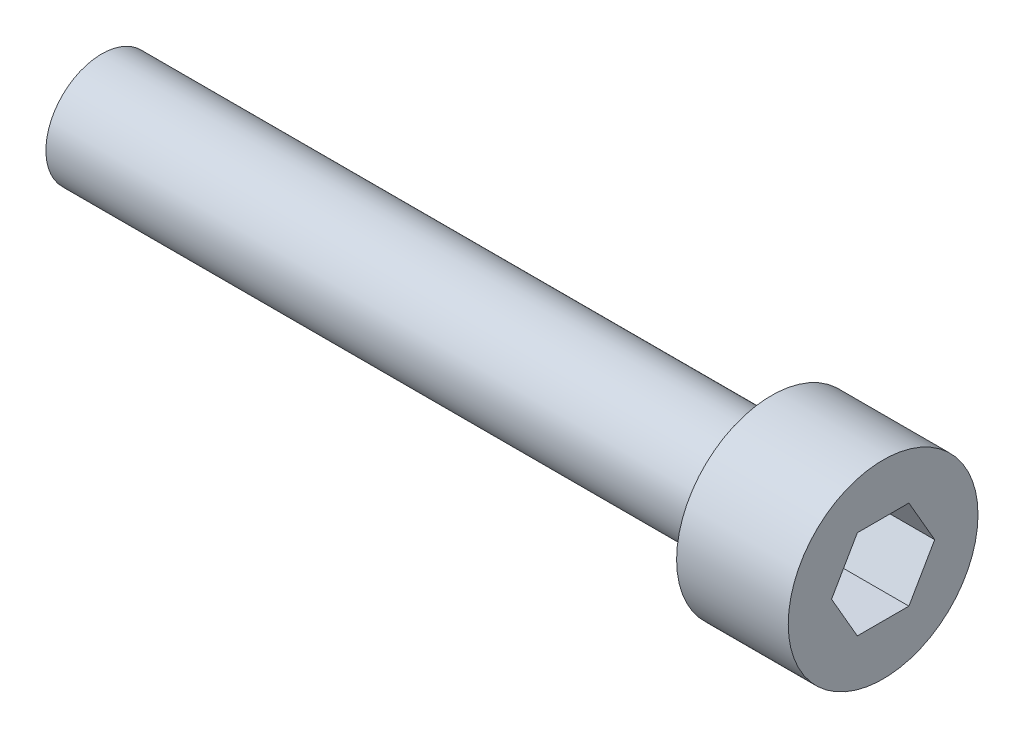
ISO-10303-21;
HEADER;
FILE_DESCRIPTION(('STEP AP214'),'2;1');
FILE_NAME('part.step','',(''),(''),'','','');
FILE_SCHEMA(('AUTOMOTIVE_DESIGN { 1 0 10303 214 1 1 1 1 }'));
ENDSEC;
DATA;
#1=APPLICATION_CONTEXT('core data for automotive mechanical design processes');
#2=APPLICATION_PROTOCOL_DEFINITION('international standard','automotive_design',2000,#1);
#3=PRODUCT_CONTEXT('',#1,'mechanical');
#4=PRODUCT('Part','Part','',(#3));
#5=PRODUCT_RELATED_PRODUCT_CATEGORY('part','',(#4));
#6=PRODUCT_DEFINITION_FORMATION('','',#4);
#7=PRODUCT_DEFINITION_CONTEXT('part definition',#1,'design');
#8=PRODUCT_DEFINITION('design','',#6,#7);
#9=PRODUCT_DEFINITION_SHAPE('','',#8);
#10=(LENGTH_UNIT() NAMED_UNIT(*) SI_UNIT(.MILLI.,.METRE.));
#11=(NAMED_UNIT(*) PLANE_ANGLE_UNIT() SI_UNIT($,.RADIAN.));
#12=(NAMED_UNIT(*) SI_UNIT($,.STERADIAN.) SOLID_ANGLE_UNIT());
#13=UNCERTAINTY_MEASURE_WITH_UNIT(LENGTH_MEASURE(1.E-05),#10,'distance_accuracy_value','');
#14=(GEOMETRIC_REPRESENTATION_CONTEXT(3) GLOBAL_UNCERTAINTY_ASSIGNED_CONTEXT((#13)) GLOBAL_UNIT_ASSIGNED_CONTEXT((#10,
#11,#12)) REPRESENTATION_CONTEXT('',''));
#15=CARTESIAN_POINT('',(0.,0.,0.));
#16=DIRECTION('',(0.,0.,1.));
#17=DIRECTION('',(1.,0.,0.));
#18=AXIS2_PLACEMENT_3D('',#15,#16,#17);
#19=CARTESIAN_POINT('',(30.,0.,0.));
#20=DIRECTION('',(-1.,0.,0.));
#21=DIRECTION('',(0.,0.,1.));
#22=AXIS2_PLACEMENT_3D('',#19,#20,#21);
#23=CYLINDRICAL_SURFACE('',#22,2.5);
#24=CARTESIAN_POINT('',(30.,0.,0.));
#25=DIRECTION('',(1.,0.,0.));
#26=DIRECTION('',(0.,0.,-1.));
#27=AXIS2_PLACEMENT_3D('',#24,#25,#26);
#28=CIRCLE('',#27,2.5);
#29=CARTESIAN_POINT('',(30.,0.,-2.5));
#30=VERTEX_POINT('',#29);
#31=EDGE_CURVE('E11',#30,#30,#28,.T.);
#32=ORIENTED_EDGE('',*,*,#31,.F.);
#33=EDGE_LOOP('',(#32));
#34=FACE_BOUND('',#33,.T.);
#35=CARTESIAN_POINT('',(0.,0.,0.));
#36=DIRECTION('',(1.,0.,0.));
#37=DIRECTION('',(0.,0.,-1.));
#38=AXIS2_PLACEMENT_3D('',#35,#36,#37);
#39=CIRCLE('',#38,2.5);
#40=CARTESIAN_POINT('',(0.,0.,-2.5));
#41=VERTEX_POINT('',#40);
#42=EDGE_CURVE('E37',#41,#41,#39,.T.);
#43=ORIENTED_EDGE('',*,*,#42,.T.);
#44=EDGE_LOOP('',(#43));
#45=FACE_BOUND('',#44,.T.);
#46=ADVANCED_FACE('F34',(#34,#45),#23,.T.);
#47=CARTESIAN_POINT('',(0.,0.,0.));
#48=DIRECTION('',(1.,0.,0.));
#49=DIRECTION('',(0.,0.,-1.));
#50=AXIS2_PLACEMENT_3D('',#47,#48,#49);
#51=PLANE('',#50);
#52=ORIENTED_EDGE('',*,*,#42,.F.);
#53=EDGE_LOOP('',(#52));
#54=FACE_BOUND('',#53,.T.);
#55=ADVANCED_FACE('F165',(#54),#51,.F.);
#56=CARTESIAN_POINT('',(35.,0.,0.));
#57=DIRECTION('',(-1.,0.,0.));
#58=DIRECTION('',(0.,0.,1.));
#59=AXIS2_PLACEMENT_3D('',#56,#57,#58);
#60=CYLINDRICAL_SURFACE('',#59,4.25);
#61=CARTESIAN_POINT('',(35.,0.,0.));
#62=DIRECTION('',(1.,0.,0.));
#63=DIRECTION('',(0.,0.,-1.));
#64=AXIS2_PLACEMENT_3D('',#61,#62,#63);
#65=CIRCLE('',#64,4.25);
#66=CARTESIAN_POINT('',(35.,0.,-4.25));
#67=VERTEX_POINT('',#66);
#68=EDGE_CURVE('E141',#67,#67,#65,.T.);
#69=ORIENTED_EDGE('',*,*,#68,.F.);
#70=EDGE_LOOP('',(#69));
#71=FACE_BOUND('',#70,.T.);
#72=CARTESIAN_POINT('',(30.,0.,0.));
#73=DIRECTION('',(1.,0.,0.));
#74=DIRECTION('',(0.,0.,-1.));
#75=AXIS2_PLACEMENT_3D('',#72,#73,#74);
#76=CIRCLE('',#75,4.25);
#77=CARTESIAN_POINT('',(30.,0.,-4.25));
#78=VERTEX_POINT('',#77);
#79=EDGE_CURVE('E135',#78,#78,#76,.T.);
#80=ORIENTED_EDGE('',*,*,#79,.T.);
#81=EDGE_LOOP('',(#80));
#82=FACE_BOUND('',#81,.T.);
#83=ADVANCED_FACE('F147',(#71,#82),#60,.T.);
#84=CARTESIAN_POINT('',(35.,0.,0.));
#85=DIRECTION('',(1.,0.,0.));
#86=DIRECTION('',(0.,0.,-1.));
#87=AXIS2_PLACEMENT_3D('',#84,#85,#86);
#88=PLANE('',#87);
#89=DIRECTION('',(0.,0.866025403784439,-0.5));
#90=VECTOR('',#89,1.);
#91=CARTESIAN_POINT('',(35.,-2.,-1.15470053837925));
#92=LINE('',#91,#90);
#93=CARTESIAN_POINT('',(35.,-2.,-1.15470053837925));
#94=VERTEX_POINT('',#93);
#95=CARTESIAN_POINT('',(35.,0.,-2.3094010767585));
#96=VERTEX_POINT('',#95);
#97=EDGE_CURVE('E48',#94,#96,#92,.T.);
#98=ORIENTED_EDGE('',*,*,#97,.F.);
#99=DIRECTION('',(0.,0.,-1.));
#100=VECTOR('',#99,1.);
#101=CARTESIAN_POINT('',(35.,-2.,1.15470053837925));
#102=LINE('',#101,#100);
#103=CARTESIAN_POINT('',(35.,-2.,1.15470053837925));
#104=VERTEX_POINT('',#103);
#105=EDGE_CURVE('E131',#104,#94,#102,.T.);
#106=ORIENTED_EDGE('',*,*,#105,.F.);
#107=DIRECTION('',(0.,-0.866025403784439,-0.5));
#108=VECTOR('',#107,1.);
#109=CARTESIAN_POINT('',(35.,0.,2.3094010767585));
#110=LINE('',#109,#108);
#111=CARTESIAN_POINT('',(35.,0.,2.3094010767585));
#112=VERTEX_POINT('',#111);
#113=EDGE_CURVE('E129',#112,#104,#110,.T.);
#114=ORIENTED_EDGE('',*,*,#113,.F.);
#115=DIRECTION('',(0.,-0.866025403784439,0.5));
#116=VECTOR('',#115,1.);
#117=CARTESIAN_POINT('',(35.,2.,1.15470053837925));
#118=LINE('',#117,#116);
#119=CARTESIAN_POINT('',(35.,2.,1.15470053837925));
#120=VERTEX_POINT('',#119);
#121=EDGE_CURVE('E96',#120,#112,#118,.T.);
#122=ORIENTED_EDGE('',*,*,#121,.F.);
#123=DIRECTION('',(0.,0.,1.));
#124=VECTOR('',#123,1.);
#125=CARTESIAN_POINT('',(35.,2.,-1.15470053837925));
#126=LINE('',#125,#124);
#127=CARTESIAN_POINT('',(35.,2.,-1.15470053837925));
#128=VERTEX_POINT('',#127);
#129=EDGE_CURVE('E125',#128,#120,#126,.T.);
#130=ORIENTED_EDGE('',*,*,#129,.F.);
#131=DIRECTION('',(0.,0.866025403784439,0.5));
#132=VECTOR('',#131,1.);
#133=CARTESIAN_POINT('',(35.,0.,-2.3094010767585));
#134=LINE('',#133,#132);
#135=EDGE_CURVE('E122',#96,#128,#134,.T.);
#136=ORIENTED_EDGE('',*,*,#135,.F.);
#137=EDGE_LOOP('',(#98,#106,#114,#122,#130,#136));
#138=FACE_BOUND('',#137,.T.);
#139=ORIENTED_EDGE('',*,*,#68,.T.);
#140=EDGE_LOOP('',(#139));
#141=FACE_BOUND('',#140,.T.);
#142=ADVANCED_FACE('F152',(#138,#141),#88,.T.);
#143=CARTESIAN_POINT('',(30.,0.,0.));
#144=DIRECTION('',(1.,0.,0.));
#145=DIRECTION('',(0.,0.,-1.));
#146=AXIS2_PLACEMENT_3D('',#143,#144,#145);
#147=PLANE('',#146);
#148=ORIENTED_EDGE('',*,*,#31,.T.);
#149=EDGE_LOOP('',(#148));
#150=FACE_BOUND('',#149,.T.);
#151=ORIENTED_EDGE('',*,*,#79,.F.);
#152=EDGE_LOOP('',(#151));
#153=FACE_BOUND('',#152,.T.);
#154=ADVANCED_FACE('F149',(#150,#153),#147,.F.);
#155=CARTESIAN_POINT('',(31.5,-2.,-1.15470053837925));
#156=DIRECTION('',(0.,-0.5,-0.866025403784439));
#157=DIRECTION('',(0.,0.866025403784439,-0.5));
#158=AXIS2_PLACEMENT_3D('',#155,#156,#157);
#159=PLANE('',#158);
#160=ORIENTED_EDGE('',*,*,#97,.T.);
#161=DIRECTION('',(1.,0.,0.));
#162=VECTOR('',#161,1.);
#163=CARTESIAN_POINT('',(31.5,0.,-2.3094010767585));
#164=LINE('',#163,#162);
#165=CARTESIAN_POINT('',(31.5,0.,-2.3094010767585));
#166=VERTEX_POINT('',#165);
#167=EDGE_CURVE('E78',#166,#96,#164,.T.);
#168=ORIENTED_EDGE('',*,*,#167,.F.);
#169=DIRECTION('',(0.,0.866025403784439,-0.5));
#170=VECTOR('',#169,1.);
#171=CARTESIAN_POINT('',(31.5,-2.,-1.15470053837925));
#172=LINE('',#171,#170);
#173=CARTESIAN_POINT('',(31.5,-2.,-1.15470053837925));
#174=VERTEX_POINT('',#173);
#175=EDGE_CURVE('E133',#174,#166,#172,.T.);
#176=ORIENTED_EDGE('',*,*,#175,.F.);
#177=DIRECTION('',(1.,0.,0.));
#178=VECTOR('',#177,1.);
#179=CARTESIAN_POINT('',(31.5,-2.,-1.15470053837925));
#180=LINE('',#179,#178);
#181=EDGE_CURVE('E56',#174,#94,#180,.T.);
#182=ORIENTED_EDGE('',*,*,#181,.T.);
#183=EDGE_LOOP('',(#160,#168,#176,#182));
#184=FACE_BOUND('',#183,.T.);
#185=ADVANCED_FACE('F151',(#184),#159,.F.);
#186=CARTESIAN_POINT('',(31.5,-2.,1.15470053837925));
#187=DIRECTION('',(0.,-1.,0.));
#188=DIRECTION('',(0.,0.,-1.));
#189=AXIS2_PLACEMENT_3D('',#186,#187,#188);
#190=PLANE('',#189);
#191=ORIENTED_EDGE('',*,*,#105,.T.);
#192=ORIENTED_EDGE('',*,*,#181,.F.);
#193=DIRECTION('',(0.,0.,-1.));
#194=VECTOR('',#193,1.);
#195=CARTESIAN_POINT('',(31.5,-2.,1.15470053837925));
#196=LINE('',#195,#194);
#197=CARTESIAN_POINT('',(31.5,-2.,1.15470053837925));
#198=VERTEX_POINT('',#197);
#199=EDGE_CURVE('E108',#198,#174,#196,.T.);
#200=ORIENTED_EDGE('',*,*,#199,.F.);
#201=DIRECTION('',(1.,0.,0.));
#202=VECTOR('',#201,1.);
#203=CARTESIAN_POINT('',(31.5,-2.,1.15470053837925));
#204=LINE('',#203,#202);
#205=EDGE_CURVE('E100',#198,#104,#204,.T.);
#206=ORIENTED_EDGE('',*,*,#205,.T.);
#207=EDGE_LOOP('',(#191,#192,#200,#206));
#208=FACE_BOUND('',#207,.T.);
#209=ADVANCED_FACE('F159',(#208),#190,.F.);
#210=CARTESIAN_POINT('',(31.5,0.,2.3094010767585));
#211=DIRECTION('',(0.,-0.5,0.866025403784439));
#212=DIRECTION('',(0.,-0.866025403784439,-0.5));
#213=AXIS2_PLACEMENT_3D('',#210,#211,#212);
#214=PLANE('',#213);
#215=ORIENTED_EDGE('',*,*,#113,.T.);
#216=ORIENTED_EDGE('',*,*,#205,.F.);
#217=DIRECTION('',(0.,-0.866025403784439,-0.5));
#218=VECTOR('',#217,1.);
#219=CARTESIAN_POINT('',(31.5,0.,2.3094010767585));
#220=LINE('',#219,#218);
#221=CARTESIAN_POINT('',(31.5,0.,2.3094010767585));
#222=VERTEX_POINT('',#221);
#223=EDGE_CURVE('E104',#222,#198,#220,.T.);
#224=ORIENTED_EDGE('',*,*,#223,.F.);
#225=DIRECTION('',(1.,0.,0.));
#226=VECTOR('',#225,1.);
#227=CARTESIAN_POINT('',(31.5,0.,2.3094010767585));
#228=LINE('',#227,#226);
#229=EDGE_CURVE('E89',#222,#112,#228,.T.);
#230=ORIENTED_EDGE('',*,*,#229,.T.);
#231=EDGE_LOOP('',(#215,#216,#224,#230));
#232=FACE_BOUND('',#231,.T.);
#233=ADVANCED_FACE('F105',(#232),#214,.F.);
#234=CARTESIAN_POINT('',(31.5,2.,1.15470053837925));
#235=DIRECTION('',(0.,0.5,0.866025403784439));
#236=DIRECTION('',(0.,-0.866025403784439,0.5));
#237=AXIS2_PLACEMENT_3D('',#234,#235,#236);
#238=PLANE('',#237);
#239=ORIENTED_EDGE('',*,*,#121,.T.);
#240=ORIENTED_EDGE('',*,*,#229,.F.);
#241=DIRECTION('',(0.,-0.866025403784439,0.5));
#242=VECTOR('',#241,1.);
#243=CARTESIAN_POINT('',(31.5,2.,1.15470053837925));
#244=LINE('',#243,#242);
#245=CARTESIAN_POINT('',(31.5,2.,1.15470053837925));
#246=VERTEX_POINT('',#245);
#247=EDGE_CURVE('E93',#246,#222,#244,.T.);
#248=ORIENTED_EDGE('',*,*,#247,.F.);
#249=DIRECTION('',(1.,0.,0.));
#250=VECTOR('',#249,1.);
#251=CARTESIAN_POINT('',(31.5,2.,1.15470053837925));
#252=LINE('',#251,#250);
#253=EDGE_CURVE('E101',#246,#120,#252,.T.);
#254=ORIENTED_EDGE('',*,*,#253,.T.);
#255=EDGE_LOOP('',(#239,#240,#248,#254));
#256=FACE_BOUND('',#255,.T.);
#257=ADVANCED_FACE('F91',(#256),#238,.F.);
#258=CARTESIAN_POINT('',(31.5,2.,-1.15470053837925));
#259=DIRECTION('',(0.,1.,0.));
#260=DIRECTION('',(0.,0.,1.));
#261=AXIS2_PLACEMENT_3D('',#258,#259,#260);
#262=PLANE('',#261);
#263=ORIENTED_EDGE('',*,*,#129,.T.);
#264=ORIENTED_EDGE('',*,*,#253,.F.);
#265=DIRECTION('',(0.,0.,1.));
#266=VECTOR('',#265,1.);
#267=CARTESIAN_POINT('',(31.5,2.,-1.15470053837925));
#268=LINE('',#267,#266);
#269=CARTESIAN_POINT('',(31.5,2.,-1.15470053837925));
#270=VERTEX_POINT('',#269);
#271=EDGE_CURVE('E114',#270,#246,#268,.T.);
#272=ORIENTED_EDGE('',*,*,#271,.F.);
#273=DIRECTION('',(1.,0.,0.));
#274=VECTOR('',#273,1.);
#275=CARTESIAN_POINT('',(31.5,2.,-1.15470053837925));
#276=LINE('',#275,#274);
#277=EDGE_CURVE('E138',#270,#128,#276,.T.);
#278=ORIENTED_EDGE('',*,*,#277,.T.);
#279=EDGE_LOOP('',(#263,#264,#272,#278));
#280=FACE_BOUND('',#279,.T.);
#281=ADVANCED_FACE('F220',(#280),#262,.F.);
#282=CARTESIAN_POINT('',(31.5,0.,-2.3094010767585));
#283=DIRECTION('',(0.,0.5,-0.866025403784439));
#284=DIRECTION('',(0.,0.866025403784439,0.5));
#285=AXIS2_PLACEMENT_3D('',#282,#283,#284);
#286=PLANE('',#285);
#287=ORIENTED_EDGE('',*,*,#135,.T.);
#288=ORIENTED_EDGE('',*,*,#277,.F.);
#289=DIRECTION('',(0.,0.866025403784439,0.5));
#290=VECTOR('',#289,1.);
#291=CARTESIAN_POINT('',(31.5,0.,-2.3094010767585));
#292=LINE('',#291,#290);
#293=EDGE_CURVE('E116',#166,#270,#292,.T.);
#294=ORIENTED_EDGE('',*,*,#293,.F.);
#295=ORIENTED_EDGE('',*,*,#167,.T.);
#296=EDGE_LOOP('',(#287,#288,#294,#295));
#297=FACE_BOUND('',#296,.T.);
#298=ADVANCED_FACE('F229',(#297),#286,.F.);
#299=CARTESIAN_POINT('',(31.5,0.,0.));
#300=DIRECTION('',(1.,0.,0.));
#301=DIRECTION('',(0.,0.,-1.));
#302=AXIS2_PLACEMENT_3D('',#299,#300,#301);
#303=PLANE('',#302);
#304=ORIENTED_EDGE('',*,*,#175,.T.);
#305=ORIENTED_EDGE('',*,*,#293,.T.);
#306=ORIENTED_EDGE('',*,*,#271,.T.);
#307=ORIENTED_EDGE('',*,*,#247,.T.);
#308=ORIENTED_EDGE('',*,*,#223,.T.);
#309=ORIENTED_EDGE('',*,*,#199,.T.);
#310=EDGE_LOOP('',(#304,#305,#306,#307,#308,#309));
#311=FACE_BOUND('',#310,.T.);
#312=ADVANCED_FACE('F111',(#311),#303,.T.);
#313=CLOSED_SHELL('',(#46,#55,#83,#142,#154,#185,#209,#233,#257,#281,#298,#312));
#314=MANIFOLD_SOLID_BREP('B2',#313);
#315=ADVANCED_BREP_SHAPE_REPRESENTATION('',(#18,#314),#14);
#316=SHAPE_DEFINITION_REPRESENTATION(#9,#315);
ENDSEC;
END-ISO-10303-21;
